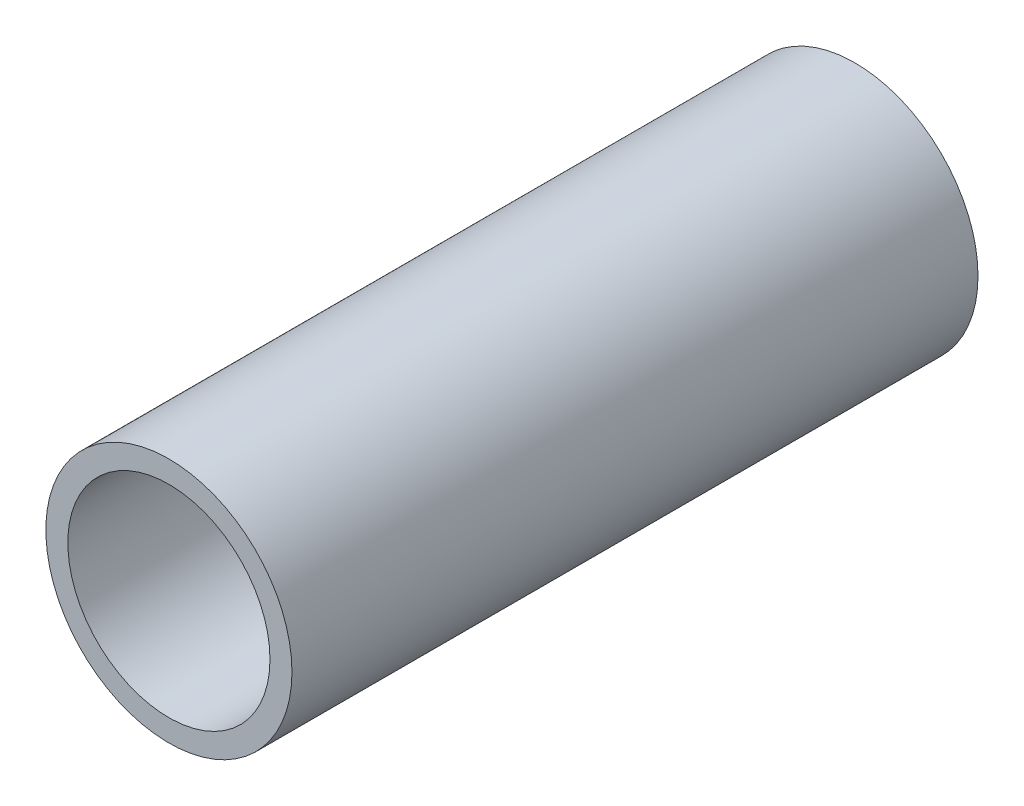
ISO-10303-21;
HEADER;
FILE_DESCRIPTION(('STEP AP214'),'2;1');
FILE_NAME('part.step','',(''),(''),'','','');
FILE_SCHEMA(('AUTOMOTIVE_DESIGN { 1 0 10303 214 1 1 1 1 }'));
ENDSEC;
DATA;
#1=APPLICATION_CONTEXT('core data for automotive mechanical design processes');
#2=APPLICATION_PROTOCOL_DEFINITION('international standard','automotive_design',2000,#1);
#3=PRODUCT_CONTEXT('',#1,'mechanical');
#4=PRODUCT('Part','Part','',(#3));
#5=PRODUCT_RELATED_PRODUCT_CATEGORY('part','',(#4));
#6=PRODUCT_DEFINITION_FORMATION('','',#4);
#7=PRODUCT_DEFINITION_CONTEXT('part definition',#1,'design');
#8=PRODUCT_DEFINITION('design','',#6,#7);
#9=PRODUCT_DEFINITION_SHAPE('','',#8);
#10=(LENGTH_UNIT() NAMED_UNIT(*) SI_UNIT(.MILLI.,.METRE.));
#11=(NAMED_UNIT(*) PLANE_ANGLE_UNIT() SI_UNIT($,.RADIAN.));
#12=(NAMED_UNIT(*) SI_UNIT($,.STERADIAN.) SOLID_ANGLE_UNIT());
#13=UNCERTAINTY_MEASURE_WITH_UNIT(LENGTH_MEASURE(1.E-05),#10,'distance_accuracy_value','');
#14=(GEOMETRIC_REPRESENTATION_CONTEXT(3) GLOBAL_UNCERTAINTY_ASSIGNED_CONTEXT((#13)) GLOBAL_UNIT_ASSIGNED_CONTEXT((#10,
#11,#12)) REPRESENTATION_CONTEXT('',''));
#15=CARTESIAN_POINT('',(0.,0.,0.));
#16=DIRECTION('',(0.,0.,1.));
#17=DIRECTION('',(1.,0.,0.));
#18=AXIS2_PLACEMENT_3D('',#15,#16,#17);
#19=CARTESIAN_POINT('',(0.,0.,31.22));
#20=DIRECTION('',(0.,0.,1.));
#21=DIRECTION('',(1.,0.,0.));
#22=AXIS2_PLACEMENT_3D('',#19,#20,#21);
#23=PLANE('',#22);
#24=CARTESIAN_POINT('',(0.,0.,31.22));
#25=DIRECTION('',(0.,0.,1.));
#26=DIRECTION('',(1.,0.,0.));
#27=AXIS2_PLACEMENT_3D('',#24,#25,#26);
#28=CIRCLE('',#27,5.6);
#29=CARTESIAN_POINT('',(5.6,0.,31.22));
#30=VERTEX_POINT('',#29);
#31=EDGE_CURVE('E10',#30,#30,#28,.T.);
#32=ORIENTED_EDGE('',*,*,#31,.T.);
#33=EDGE_LOOP('',(#32));
#34=FACE_BOUND('',#33,.T.);
#35=CARTESIAN_POINT('',(0.,0.,31.22));
#36=DIRECTION('',(0.,0.,1.));
#37=DIRECTION('',(1.,0.,0.));
#38=AXIS2_PLACEMENT_3D('',#35,#36,#37);
#39=CIRCLE('',#38,4.6);
#40=CARTESIAN_POINT('',(4.6,0.,31.22));
#41=VERTEX_POINT('',#40);
#42=EDGE_CURVE('E41',#41,#41,#39,.T.);
#43=ORIENTED_EDGE('',*,*,#42,.F.);
#44=EDGE_LOOP('',(#43));
#45=FACE_BOUND('',#44,.T.);
#46=ADVANCED_FACE('F30',(#34,#45),#23,.T.);
#47=CARTESIAN_POINT('',(0.,0.,0.));
#48=DIRECTION('',(0.,0.,1.));
#49=DIRECTION('',(1.,0.,0.));
#50=AXIS2_PLACEMENT_3D('',#47,#48,#49);
#51=PLANE('',#50);
#52=CARTESIAN_POINT('',(0.,0.,0.));
#53=DIRECTION('',(0.,0.,1.));
#54=DIRECTION('',(1.,0.,0.));
#55=AXIS2_PLACEMENT_3D('',#52,#53,#54);
#56=CIRCLE('',#55,5.6);
#57=CARTESIAN_POINT('',(5.6,0.,0.));
#58=VERTEX_POINT('',#57);
#59=EDGE_CURVE('E34',#58,#58,#56,.T.);
#60=ORIENTED_EDGE('',*,*,#59,.F.);
#61=EDGE_LOOP('',(#60));
#62=FACE_BOUND('',#61,.T.);
#63=CARTESIAN_POINT('',(0.,0.,0.));
#64=DIRECTION('',(0.,0.,1.));
#65=DIRECTION('',(1.,0.,0.));
#66=AXIS2_PLACEMENT_3D('',#63,#64,#65);
#67=CIRCLE('',#66,4.6);
#68=CARTESIAN_POINT('',(4.6,0.,0.));
#69=VERTEX_POINT('',#68);
#70=EDGE_CURVE('E43',#69,#69,#67,.T.);
#71=ORIENTED_EDGE('',*,*,#70,.T.);
#72=EDGE_LOOP('',(#71));
#73=FACE_BOUND('',#72,.T.);
#74=ADVANCED_FACE('F53',(#62,#73),#51,.F.);
#75=CARTESIAN_POINT('',(0.,0.,31.22));
#76=DIRECTION('',(0.,0.,-1.));
#77=DIRECTION('',(-1.,0.,0.));
#78=AXIS2_PLACEMENT_3D('',#75,#76,#77);
#79=CYLINDRICAL_SURFACE('',#78,5.6);
#80=ORIENTED_EDGE('',*,*,#31,.F.);
#81=EDGE_LOOP('',(#80));
#82=FACE_BOUND('',#81,.T.);
#83=ORIENTED_EDGE('',*,*,#59,.T.);
#84=EDGE_LOOP('',(#83));
#85=FACE_BOUND('',#84,.T.);
#86=ADVANCED_FACE('F32',(#82,#85),#79,.T.);
#87=CARTESIAN_POINT('',(0.,0.,31.22));
#88=DIRECTION('',(0.,0.,-1.));
#89=DIRECTION('',(-1.,0.,0.));
#90=AXIS2_PLACEMENT_3D('',#87,#88,#89);
#91=CYLINDRICAL_SURFACE('',#90,4.6);
#92=ORIENTED_EDGE('',*,*,#42,.T.);
#93=EDGE_LOOP('',(#92));
#94=FACE_BOUND('',#93,.T.);
#95=ORIENTED_EDGE('',*,*,#70,.F.);
#96=EDGE_LOOP('',(#95));
#97=FACE_BOUND('',#96,.T.);
#98=ADVANCED_FACE('F49',(#94,#97),#91,.F.);
#99=CLOSED_SHELL('',(#46,#74,#86,#98));
#100=MANIFOLD_SOLID_BREP('B2',#99);
#101=ADVANCED_BREP_SHAPE_REPRESENTATION('',(#18,#100),#14);
#102=SHAPE_DEFINITION_REPRESENTATION(#9,#101);
ENDSEC;
END-ISO-10303-21;
